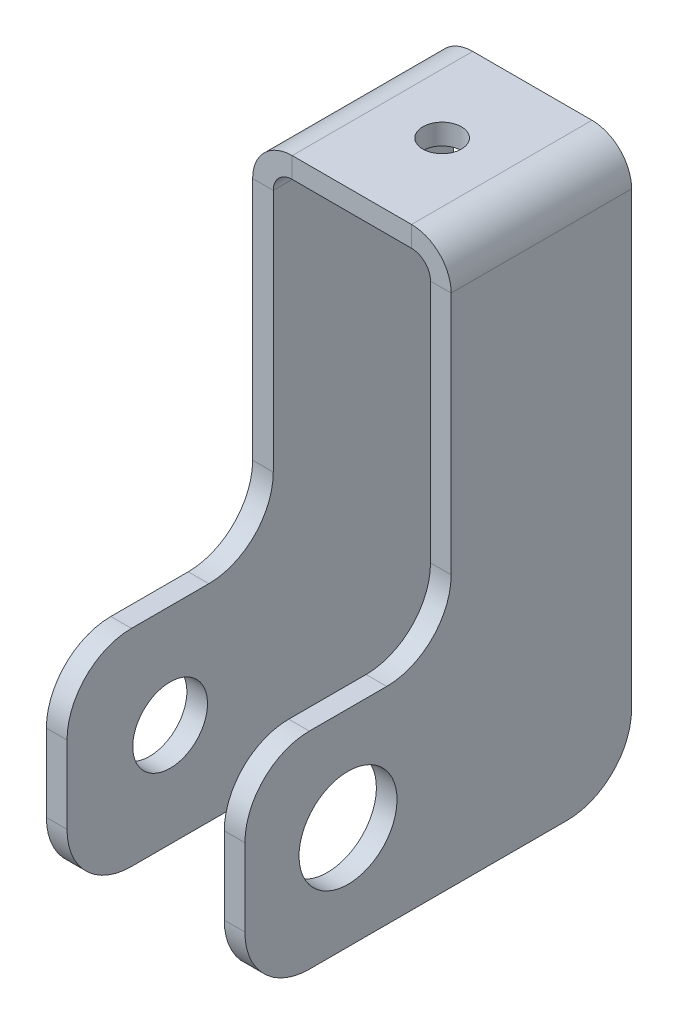
ISO-10303-21;
HEADER;
FILE_DESCRIPTION(('STEP AP214'),'2;1');
FILE_NAME('part.step','',(''),(''),'','','');
FILE_SCHEMA(('AUTOMOTIVE_DESIGN { 1 0 10303 214 1 1 1 1 }'));
ENDSEC;
DATA;
#1=APPLICATION_CONTEXT('core data for automotive mechanical design processes');
#2=APPLICATION_PROTOCOL_DEFINITION('international standard','automotive_design',2000,#1);
#3=PRODUCT_CONTEXT('',#1,'mechanical');
#4=PRODUCT('Part','Part','',(#3));
#5=PRODUCT_RELATED_PRODUCT_CATEGORY('part','',(#4));
#6=PRODUCT_DEFINITION_FORMATION('','',#4);
#7=PRODUCT_DEFINITION_CONTEXT('part definition',#1,'design');
#8=PRODUCT_DEFINITION('design','',#6,#7);
#9=PRODUCT_DEFINITION_SHAPE('','',#8);
#10=(LENGTH_UNIT() NAMED_UNIT(*) SI_UNIT(.MILLI.,.METRE.));
#11=(NAMED_UNIT(*) PLANE_ANGLE_UNIT() SI_UNIT($,.RADIAN.));
#12=(NAMED_UNIT(*) SI_UNIT($,.STERADIAN.) SOLID_ANGLE_UNIT());
#13=UNCERTAINTY_MEASURE_WITH_UNIT(LENGTH_MEASURE(1.E-05),#10,'distance_accuracy_value','');
#14=(GEOMETRIC_REPRESENTATION_CONTEXT(3) GLOBAL_UNCERTAINTY_ASSIGNED_CONTEXT((#13)) GLOBAL_UNIT_ASSIGNED_CONTEXT((#10,
#11,#12)) REPRESENTATION_CONTEXT('',''));
#15=CARTESIAN_POINT('',(0.,0.,0.));
#16=DIRECTION('',(0.,0.,1.));
#17=DIRECTION('',(1.,0.,0.));
#18=AXIS2_PLACEMENT_3D('',#15,#16,#17);
#19=CARTESIAN_POINT('',(0.,-0.8,0.));
#20=DIRECTION('',(0.,1.,0.));
#21=DIRECTION('',(0.,0.,1.));
#22=AXIS2_PLACEMENT_3D('',#19,#20,#21);
#23=PLANE('',#22);
#24=CARTESIAN_POINT('',(2.,-0.8,0.0195312499999961));
#25=DIRECTION('',(0.,1.,0.));
#26=DIRECTION('',(0.,0.,1.));
#27=AXIS2_PLACEMENT_3D('',#24,#25,#26);
#28=CIRCLE('',#27,0.75);
#29=CARTESIAN_POINT('',(2.,-0.8,0.769531249999996));
#30=VERTEX_POINT('',#29);
#31=EDGE_CURVE('E352',#30,#30,#28,.T.);
#32=ORIENTED_EDGE('',*,*,#31,.T.);
#33=EDGE_LOOP('',(#32));
#34=FACE_BOUND('',#33,.T.);
#35=DIRECTION('',(0.,0.,1.));
#36=VECTOR('',#35,1.);
#37=CARTESIAN_POINT('',(4.3134,-0.8,3.51953125));
#38=LINE('',#37,#36);
#39=CARTESIAN_POINT('',(4.3134,-0.8,3.51953125));
#40=VERTEX_POINT('',#39);
#41=CARTESIAN_POINT('',(4.3134,-0.800000000000001,-3.48046875));
#42=VERTEX_POINT('',#41);
#43=EDGE_CURVE('E344',#40,#42,#38,.F.);
#44=ORIENTED_EDGE('',*,*,#43,.F.);
#45=DIRECTION('',(1.,0.,0.));
#46=VECTOR('',#45,1.);
#47=CARTESIAN_POINT('',(-1.85,-0.8,3.51953125));
#48=LINE('',#47,#46);
#49=CARTESIAN_POINT('',(-0.313400000000003,-0.799999999999999,3.51953125));
#50=VERTEX_POINT('',#49);
#51=EDGE_CURVE('E438',#50,#40,#48,.T.);
#52=ORIENTED_EDGE('',*,*,#51,.F.);
#53=DIRECTION('',(0.,0.,-1.));
#54=VECTOR('',#53,1.);
#55=CARTESIAN_POINT('',(-0.313400000000002,-0.8,-3.48046875));
#56=LINE('',#55,#54);
#57=CARTESIAN_POINT('',(-0.313400000000002,-0.8,-3.48046875));
#58=VERTEX_POINT('',#57);
#59=EDGE_CURVE('E428',#58,#50,#56,.F.);
#60=ORIENTED_EDGE('',*,*,#59,.F.);
#61=DIRECTION('',(-1.,0.,0.));
#62=VECTOR('',#61,1.);
#63=CARTESIAN_POINT('',(-1.85,-0.8,-3.48046875));
#64=LINE('',#63,#62);
#65=EDGE_CURVE('E441',#42,#58,#64,.T.);
#66=ORIENTED_EDGE('',*,*,#65,.F.);
#67=EDGE_LOOP('',(#44,#52,#60,#66));
#68=FACE_BOUND('',#67,.T.);
#69=ADVANCED_FACE('F111',(#34,#68),#23,.F.);
#70=CARTESIAN_POINT('',(0.,0.,0.));
#71=DIRECTION('',(0.,1.,0.));
#72=DIRECTION('',(0.,0.,1.));
#73=AXIS2_PLACEMENT_3D('',#70,#71,#72);
#74=PLANE('',#73);
#75=CARTESIAN_POINT('',(2.,0.,0.0195312499999961));
#76=DIRECTION('',(0.,1.,0.));
#77=DIRECTION('',(0.,0.,1.));
#78=AXIS2_PLACEMENT_3D('',#75,#76,#77);
#79=CIRCLE('',#78,0.75);
#80=CARTESIAN_POINT('',(2.,0.,0.769531249999996));
#81=VERTEX_POINT('',#80);
#82=EDGE_CURVE('E350',#81,#81,#79,.T.);
#83=ORIENTED_EDGE('',*,*,#82,.F.);
#84=EDGE_LOOP('',(#83));
#85=FACE_BOUND('',#84,.T.);
#86=DIRECTION('',(1.,0.,0.));
#87=VECTOR('',#86,1.);
#88=CARTESIAN_POINT('',(-1.85,0.,3.51953125));
#89=LINE('',#88,#87);
#90=CARTESIAN_POINT('',(-0.313400000000003,0.,3.51953125));
#91=VERTEX_POINT('',#90);
#92=CARTESIAN_POINT('',(4.3134,0.,3.51953125));
#93=VERTEX_POINT('',#92);
#94=EDGE_CURVE('E435',#91,#93,#89,.T.);
#95=ORIENTED_EDGE('',*,*,#94,.T.);
#96=DIRECTION('',(0.,0.,1.));
#97=VECTOR('',#96,1.);
#98=CARTESIAN_POINT('',(4.3134,0.,3.51953125));
#99=LINE('',#98,#97);
#100=CARTESIAN_POINT('',(4.3134,0.,-3.48046875));
#101=VERTEX_POINT('',#100);
#102=EDGE_CURVE('E283',#93,#101,#99,.F.);
#103=ORIENTED_EDGE('',*,*,#102,.T.);
#104=DIRECTION('',(-1.,0.,0.));
#105=VECTOR('',#104,1.);
#106=CARTESIAN_POINT('',(-1.85,0.,-3.48046875));
#107=LINE('',#106,#105);
#108=CARTESIAN_POINT('',(-0.313400000000002,0.,-3.48046875));
#109=VERTEX_POINT('',#108);
#110=EDGE_CURVE('E442',#101,#109,#107,.T.);
#111=ORIENTED_EDGE('',*,*,#110,.T.);
#112=DIRECTION('',(0.,0.,-1.));
#113=VECTOR('',#112,1.);
#114=CARTESIAN_POINT('',(-0.313400000000002,0.,-3.48046875));
#115=LINE('',#114,#113);
#116=EDGE_CURVE('E415',#109,#91,#115,.F.);
#117=ORIENTED_EDGE('',*,*,#116,.T.);
#118=EDGE_LOOP('',(#95,#103,#111,#117));
#119=FACE_BOUND('',#118,.T.);
#120=ADVANCED_FACE('F534',(#85,#119),#74,.T.);
#121=CARTESIAN_POINT('',(-1.85,-0.8,3.51953125));
#122=DIRECTION('',(0.,0.,1.));
#123=DIRECTION('',(1.,0.,0.));
#124=AXIS2_PLACEMENT_3D('',#121,#122,#123);
#125=PLANE('',#124);
#126=ORIENTED_EDGE('',*,*,#51,.T.);
#127=DIRECTION('',(0.,1.,0.));
#128=VECTOR('',#127,1.);
#129=CARTESIAN_POINT('',(4.3134,-0.8,3.51953125));
#130=LINE('',#129,#128);
#131=EDGE_CURVE('E340',#40,#93,#130,.T.);
#132=ORIENTED_EDGE('',*,*,#131,.T.);
#133=ORIENTED_EDGE('',*,*,#94,.F.);
#134=DIRECTION('',(0.,1.,0.));
#135=VECTOR('',#134,1.);
#136=CARTESIAN_POINT('',(-0.313400000000003,-0.799999999999999,3.51953125));
#137=LINE('',#136,#135);
#138=EDGE_CURVE('E432',#50,#91,#137,.T.);
#139=ORIENTED_EDGE('',*,*,#138,.F.);
#140=EDGE_LOOP('',(#126,#132,#133,#139));
#141=FACE_BOUND('',#140,.T.);
#142=ADVANCED_FACE('F532',(#141),#125,.T.);
#143=CARTESIAN_POINT('',(-1.85,-0.8,-3.48046875));
#144=DIRECTION('',(0.,0.,-1.));
#145=DIRECTION('',(-1.,0.,0.));
#146=AXIS2_PLACEMENT_3D('',#143,#144,#145);
#147=PLANE('',#146);
#148=DIRECTION('',(0.,1.,0.));
#149=VECTOR('',#148,1.);
#150=CARTESIAN_POINT('',(4.3134,-0.800000000000001,-3.48046875));
#151=LINE('',#150,#149);
#152=EDGE_CURVE('E347',#42,#101,#151,.T.);
#153=ORIENTED_EDGE('',*,*,#152,.F.);
#154=ORIENTED_EDGE('',*,*,#65,.T.);
#155=DIRECTION('',(0.,1.,0.));
#156=VECTOR('',#155,1.);
#157=CARTESIAN_POINT('',(-0.313400000000002,-0.8,-3.48046875));
#158=LINE('',#157,#156);
#159=EDGE_CURVE('E422',#58,#109,#158,.T.);
#160=ORIENTED_EDGE('',*,*,#159,.T.);
#161=ORIENTED_EDGE('',*,*,#110,.F.);
#162=EDGE_LOOP('',(#153,#154,#160,#161));
#163=FACE_BOUND('',#162,.T.);
#164=ADVANCED_FACE('F517',(#163),#147,.T.);
#165=CARTESIAN_POINT('',(-0.313400000000003,-1.5366,3.51953125));
#166=DIRECTION('',(0.,0.,1.));
#167=DIRECTION('',(1.,0.,0.));
#168=AXIS2_PLACEMENT_3D('',#165,#166,#167);
#169=PLANE('',#168);
#170=DIRECTION('',(1.,0.,0.));
#171=VECTOR('',#170,1.);
#172=CARTESIAN_POINT('',(-1.85,-1.53659999999999,3.51953125));
#173=LINE('',#172,#171);
#174=CARTESIAN_POINT('',(-1.05,-1.5366,3.51953125));
#175=VERTEX_POINT('',#174);
#176=CARTESIAN_POINT('',(-1.85,-1.53659999999999,3.51953125));
#177=VERTEX_POINT('',#176);
#178=EDGE_CURVE('E361',#175,#177,#173,.F.);
#179=ORIENTED_EDGE('',*,*,#178,.F.);
#180=CARTESIAN_POINT('',(-0.313400000000003,-1.5366,3.51953125));
#181=DIRECTION('',(0.,0.,-1.));
#182=DIRECTION('',(-1.,0.,0.));
#183=AXIS2_PLACEMENT_3D('',#180,#181,#182);
#184=CIRCLE('',#183,0.7366);
#185=EDGE_CURVE('E425',#50,#175,#184,.F.);
#186=ORIENTED_EDGE('',*,*,#185,.F.);
#187=ORIENTED_EDGE('',*,*,#138,.T.);
#188=CARTESIAN_POINT('',(-0.313400000000003,-1.5366,3.51953125));
#189=DIRECTION('',(0.,0.,-1.));
#190=DIRECTION('',(-1.,0.,0.));
#191=AXIS2_PLACEMENT_3D('',#188,#189,#190);
#192=CIRCLE('',#191,1.5366);
#193=EDGE_CURVE('E418',#91,#177,#192,.F.);
#194=ORIENTED_EDGE('',*,*,#193,.T.);
#195=EDGE_LOOP('',(#179,#186,#187,#194));
#196=FACE_BOUND('',#195,.T.);
#197=ADVANCED_FACE('F529',(#196),#169,.T.);
#198=CARTESIAN_POINT('',(-0.313400000000002,-1.5366,-3.48046875));
#199=DIRECTION('',(0.,0.,1.));
#200=DIRECTION('',(1.,0.,0.));
#201=AXIS2_PLACEMENT_3D('',#198,#199,#200);
#202=PLANE('',#201);
#203=CARTESIAN_POINT('',(-0.313400000000002,-1.5366,-3.48046875));
#204=DIRECTION('',(0.,0.,-1.));
#205=DIRECTION('',(-1.,0.,0.));
#206=AXIS2_PLACEMENT_3D('',#203,#204,#205);
#207=CIRCLE('',#206,0.7366);
#208=CARTESIAN_POINT('',(-1.05,-1.5366,-3.48046875));
#209=VERTEX_POINT('',#208);
#210=EDGE_CURVE('E371',#209,#58,#207,.T.);
#211=ORIENTED_EDGE('',*,*,#210,.F.);
#212=DIRECTION('',(1.,0.,0.));
#213=VECTOR('',#212,1.);
#214=CARTESIAN_POINT('',(-1.05,-1.5366,-3.48046875));
#215=LINE('',#214,#213);
#216=CARTESIAN_POINT('',(-1.85,-1.53659999999999,-3.48046875));
#217=VERTEX_POINT('',#216);
#218=EDGE_CURVE('E408',#209,#217,#215,.F.);
#219=ORIENTED_EDGE('',*,*,#218,.T.);
#220=CARTESIAN_POINT('',(-0.313400000000002,-1.5366,-3.48046875));
#221=DIRECTION('',(0.,0.,-1.));
#222=DIRECTION('',(-1.,0.,0.));
#223=AXIS2_PLACEMENT_3D('',#220,#221,#222);
#224=CIRCLE('',#223,1.5366);
#225=EDGE_CURVE('E419',#217,#109,#224,.T.);
#226=ORIENTED_EDGE('',*,*,#225,.T.);
#227=ORIENTED_EDGE('',*,*,#159,.F.);
#228=EDGE_LOOP('',(#211,#219,#226,#227));
#229=FACE_BOUND('',#228,.T.);
#230=ADVANCED_FACE('F539',(#229),#202,.F.);
#231=CARTESIAN_POINT('',(-0.313400000000002,-1.5366,-3.48046875));
#232=DIRECTION('',(0.,0.,-1.));
#233=DIRECTION('',(-1.,0.,0.));
#234=AXIS2_PLACEMENT_3D('',#231,#232,#233);
#235=CYLINDRICAL_SURFACE('',#234,1.5366);
#236=ORIENTED_EDGE('',*,*,#116,.F.);
#237=ORIENTED_EDGE('',*,*,#225,.F.);
#238=DIRECTION('',(0.,0.,-1.));
#239=VECTOR('',#238,1.);
#240=CARTESIAN_POINT('',(-1.85,-1.53659999999999,6.01953125));
#241=LINE('',#240,#239);
#242=EDGE_CURVE('E405',#177,#217,#241,.T.);
#243=ORIENTED_EDGE('',*,*,#242,.F.);
#244=ORIENTED_EDGE('',*,*,#193,.F.);
#245=EDGE_LOOP('',(#236,#237,#243,#244));
#246=FACE_BOUND('',#245,.T.);
#247=ADVANCED_FACE('F537',(#246),#235,.T.);
#248=CARTESIAN_POINT('',(-0.313400000000002,-1.5366,-3.48046875));
#249=DIRECTION('',(0.,0.,-1.));
#250=DIRECTION('',(-1.,0.,0.));
#251=AXIS2_PLACEMENT_3D('',#248,#249,#250);
#252=CYLINDRICAL_SURFACE('',#251,0.7366);
#253=ORIENTED_EDGE('',*,*,#59,.T.);
#254=ORIENTED_EDGE('',*,*,#185,.T.);
#255=DIRECTION('',(0.,0.,1.));
#256=VECTOR('',#255,1.);
#257=CARTESIAN_POINT('',(-1.05,-1.5366,3.51953125));
#258=LINE('',#257,#256);
#259=EDGE_CURVE('E411',#175,#209,#258,.F.);
#260=ORIENTED_EDGE('',*,*,#259,.T.);
#261=ORIENTED_EDGE('',*,*,#210,.T.);
#262=EDGE_LOOP('',(#253,#254,#260,#261));
#263=FACE_BOUND('',#262,.T.);
#264=ADVANCED_FACE('F524',(#263),#252,.F.);
#265=CARTESIAN_POINT('',(-1.85,-0.799999999999997,-3.48046875));
#266=DIRECTION('',(0.,0.,1.));
#267=DIRECTION('',(1.,0.,0.));
#268=AXIS2_PLACEMENT_3D('',#265,#266,#267);
#269=PLANE('',#268);
#270=DIRECTION('',(0.,-1.,0.));
#271=VECTOR('',#270,1.);
#272=CARTESIAN_POINT('',(-1.05,-0.8,-3.48046875));
#273=LINE('',#272,#271);
#274=CARTESIAN_POINT('',(-1.05000000000006,-19.,-3.48046875));
#275=VERTEX_POINT('',#274);
#276=EDGE_CURVE('E402',#209,#275,#273,.T.);
#277=ORIENTED_EDGE('',*,*,#276,.T.);
#278=DIRECTION('',(1.,0.,0.));
#279=VECTOR('',#278,1.);
#280=CARTESIAN_POINT('',(-1.85000000000006,-19.,-3.48046875));
#281=LINE('',#280,#279);
#282=CARTESIAN_POINT('',(-1.85000000000006,-19.,-3.48046875));
#283=VERTEX_POINT('',#282);
#284=EDGE_CURVE('E13',#275,#283,#281,.F.);
#285=ORIENTED_EDGE('',*,*,#284,.T.);
#286=DIRECTION('',(0.,1.,0.));
#287=VECTOR('',#286,1.);
#288=CARTESIAN_POINT('',(-1.85000000000003,-11.,-3.48046875));
#289=LINE('',#288,#287);
#290=EDGE_CURVE('E385',#217,#283,#289,.F.);
#291=ORIENTED_EDGE('',*,*,#290,.F.);
#292=ORIENTED_EDGE('',*,*,#218,.F.);
#293=EDGE_LOOP('',(#277,#285,#291,#292));
#294=FACE_BOUND('',#293,.T.);
#295=ADVANCED_FACE('F548',(#294),#269,.F.);
#296=CARTESIAN_POINT('',(-1.85,-0.799999999999996,3.51953125));
#297=DIRECTION('',(0.,0.,-1.));
#298=DIRECTION('',(-1.,0.,0.));
#299=AXIS2_PLACEMENT_3D('',#296,#297,#298);
#300=PLANE('',#299);
#301=ORIENTED_EDGE('',*,*,#178,.T.);
#302=DIRECTION('',(0.,-1.,0.));
#303=VECTOR('',#302,1.);
#304=CARTESIAN_POINT('',(-1.85000000000004,-11.,3.51953125));
#305=LINE('',#304,#303);
#306=CARTESIAN_POINT('',(-1.85000000000004,-11.,3.51953125));
#307=VERTEX_POINT('',#306);
#308=EDGE_CURVE('E368',#307,#177,#305,.F.);
#309=ORIENTED_EDGE('',*,*,#308,.F.);
#310=DIRECTION('',(1.,0.,0.));
#311=VECTOR('',#310,1.);
#312=CARTESIAN_POINT('',(-1.85000000000004,-11.,3.51953125));
#313=LINE('',#312,#311);
#314=CARTESIAN_POINT('',(-1.05000000000004,-11.,3.51953125));
#315=VERTEX_POINT('',#314);
#316=EDGE_CURVE('E364',#307,#315,#313,.T.);
#317=ORIENTED_EDGE('',*,*,#316,.T.);
#318=DIRECTION('',(0.,1.,0.));
#319=VECTOR('',#318,1.);
#320=CARTESIAN_POINT('',(-1.05,-0.799999999999999,3.51953125));
#321=LINE('',#320,#319);
#322=EDGE_CURVE('E388',#315,#175,#321,.T.);
#323=ORIENTED_EDGE('',*,*,#322,.T.);
#324=EDGE_LOOP('',(#301,#309,#317,#323));
#325=FACE_BOUND('',#324,.T.);
#326=ADVANCED_FACE('F582',(#325),#300,.F.);
#327=CARTESIAN_POINT('',(-1.85000000000004,-11.,6.01953125));
#328=DIRECTION('',(-1.,0.,0.));
#329=DIRECTION('',(0.,-1.,0.));
#330=AXIS2_PLACEMENT_3D('',#327,#328,#329);
#331=PLANE('',#330);
#332=CARTESIAN_POINT('',(-1.85000000000006,-17.5,7.51953125));
#333=DIRECTION('',(-1.,0.,0.));
#334=DIRECTION('',(0.,-1.,0.));
#335=AXIS2_PLACEMENT_3D('',#332,#333,#334);
#336=CIRCLE('',#335,1.45);
#337=CARTESIAN_POINT('',(-1.85000000000006,-18.95,7.51953125));
#338=VERTEX_POINT('',#337);
#339=EDGE_CURVE('E355',#338,#338,#336,.T.);
#340=ORIENTED_EDGE('',*,*,#339,.F.);
#341=EDGE_LOOP('',(#340));
#342=FACE_BOUND('',#341,.T.);
#343=DIRECTION('',(0.,0.,-1.));
#344=VECTOR('',#343,1.);
#345=CARTESIAN_POINT('',(-1.85000000000007,-21.5,6.01953125));
#346=LINE('',#345,#344);
#347=CARTESIAN_POINT('',(-1.85000000000007,-21.5,-0.98046875));
#348=VERTEX_POINT('',#347);
#349=CARTESIAN_POINT('',(-1.85000000000007,-21.5,9.01953125));
#350=VERTEX_POINT('',#349);
#351=EDGE_CURVE('E382',#348,#350,#346,.F.);
#352=ORIENTED_EDGE('',*,*,#351,.T.);
#353=CARTESIAN_POINT('',(-1.85000000000006,-19.,9.01953125));
#354=DIRECTION('',(-1.,0.,0.));
#355=DIRECTION('',(0.,-1.,0.));
#356=AXIS2_PLACEMENT_3D('',#353,#354,#355);
#357=CIRCLE('',#356,2.5);
#358=CARTESIAN_POINT('',(-1.85000000000007,-19.,11.51953125));
#359=VERTEX_POINT('',#358);
#360=EDGE_CURVE('E469',#350,#359,#357,.T.);
#361=ORIENTED_EDGE('',*,*,#360,.T.);
#362=DIRECTION('',(0.,-1.,0.));
#363=VECTOR('',#362,1.);
#364=CARTESIAN_POINT('',(-1.85000000000004,-11.,11.51953125));
#365=LINE('',#364,#363);
#366=CARTESIAN_POINT('',(-1.85000000000005,-16.,11.51953125));
#367=VERTEX_POINT('',#366);
#368=EDGE_CURVE('E379',#359,#367,#365,.F.);
#369=ORIENTED_EDGE('',*,*,#368,.T.);
#370=CARTESIAN_POINT('',(-1.85000000000005,-16.,9.01953125));
#371=DIRECTION('',(-1.,0.,0.));
#372=DIRECTION('',(0.,-1.,0.));
#373=AXIS2_PLACEMENT_3D('',#370,#371,#372);
#374=CIRCLE('',#373,2.5);
#375=CARTESIAN_POINT('',(-1.85000000000005,-13.5,9.01953125));
#376=VERTEX_POINT('',#375);
#377=EDGE_CURVE('E466',#367,#376,#374,.T.);
#378=ORIENTED_EDGE('',*,*,#377,.T.);
#379=DIRECTION('',(0.,0.,1.));
#380=VECTOR('',#379,1.);
#381=CARTESIAN_POINT('',(-1.85000000000005,-13.5,6.01953125));
#382=LINE('',#381,#380);
#383=CARTESIAN_POINT('',(-1.85000000000005,-13.5,6.01953125));
#384=VERTEX_POINT('',#383);
#385=EDGE_CURVE('E376',#376,#384,#382,.F.);
#386=ORIENTED_EDGE('',*,*,#385,.T.);
#387=CARTESIAN_POINT('',(-1.85000000000004,-11.,6.01953125));
#388=DIRECTION('',(-1.,0.,0.));
#389=DIRECTION('',(0.,-1.,0.));
#390=AXIS2_PLACEMENT_3D('',#387,#388,#389);
#391=CIRCLE('',#390,2.5);
#392=EDGE_CURVE('E374',#384,#307,#391,.F.);
#393=ORIENTED_EDGE('',*,*,#392,.T.);
#394=ORIENTED_EDGE('',*,*,#308,.T.);
#395=ORIENTED_EDGE('',*,*,#242,.T.);
#396=ORIENTED_EDGE('',*,*,#290,.T.);
#397=CARTESIAN_POINT('',(-1.85000000000006,-19.,-0.980468750000001));
#398=DIRECTION('',(-1.,0.,0.));
#399=DIRECTION('',(0.,-1.,0.));
#400=AXIS2_PLACEMENT_3D('',#397,#398,#399);
#401=CIRCLE('',#400,2.5);
#402=EDGE_CURVE('E464',#283,#348,#401,.T.);
#403=ORIENTED_EDGE('',*,*,#402,.T.);
#404=EDGE_LOOP('',(#352,#361,#369,#378,#386,#393,#394,#395,#396,#403));
#405=FACE_BOUND('',#404,.T.);
#406=ADVANCED_FACE('F545',(#342,#405),#331,.T.);
#407=CARTESIAN_POINT('',(-1.05000000000004,-11.,6.01953125));
#408=DIRECTION('',(-1.,0.,0.));
#409=DIRECTION('',(0.,-1.,0.));
#410=AXIS2_PLACEMENT_3D('',#407,#408,#409);
#411=PLANE('',#410);
#412=CARTESIAN_POINT('',(-1.05000000000006,-17.5,7.51953125));
#413=DIRECTION('',(-1.,0.,0.));
#414=DIRECTION('',(0.,-1.,0.));
#415=AXIS2_PLACEMENT_3D('',#412,#413,#414);
#416=CIRCLE('',#415,1.45);
#417=CARTESIAN_POINT('',(-1.05000000000006,-18.95,7.51953125));
#418=VERTEX_POINT('',#417);
#419=EDGE_CURVE('E358',#418,#418,#416,.T.);
#420=ORIENTED_EDGE('',*,*,#419,.T.);
#421=EDGE_LOOP('',(#420));
#422=FACE_BOUND('',#421,.T.);
#423=DIRECTION('',(0.,1.,0.));
#424=VECTOR('',#423,1.);
#425=CARTESIAN_POINT('',(-1.05000000000007,-21.5,11.51953125));
#426=LINE('',#425,#424);
#427=CARTESIAN_POINT('',(-1.05000000000006,-19.,11.51953125));
#428=VERTEX_POINT('',#427);
#429=CARTESIAN_POINT('',(-1.05000000000005,-16.,11.51953125));
#430=VERTEX_POINT('',#429);
#431=EDGE_CURVE('E396',#428,#430,#426,.T.);
#432=ORIENTED_EDGE('',*,*,#431,.F.);
#433=CARTESIAN_POINT('',(-1.05000000000006,-19.,9.01953125));
#434=DIRECTION('',(-1.,0.,0.));
#435=DIRECTION('',(0.,-1.,0.));
#436=AXIS2_PLACEMENT_3D('',#433,#434,#435);
#437=CIRCLE('',#436,2.5);
#438=CARTESIAN_POINT('',(-1.05000000000007,-21.5,9.01953125));
#439=VERTEX_POINT('',#438);
#440=EDGE_CURVE('E457',#428,#439,#437,.F.);
#441=ORIENTED_EDGE('',*,*,#440,.T.);
#442=DIRECTION('',(0.,0.,1.));
#443=VECTOR('',#442,1.);
#444=CARTESIAN_POINT('',(-1.05000000000007,-21.5,3.51953125000001));
#445=LINE('',#444,#443);
#446=CARTESIAN_POINT('',(-1.05000000000007,-21.5,-0.98046875));
#447=VERTEX_POINT('',#446);
#448=EDGE_CURVE('E399',#447,#439,#445,.T.);
#449=ORIENTED_EDGE('',*,*,#448,.F.);
#450=CARTESIAN_POINT('',(-1.05000000000006,-19.,-0.980468750000001));
#451=DIRECTION('',(-1.,0.,0.));
#452=DIRECTION('',(0.,-1.,0.));
#453=AXIS2_PLACEMENT_3D('',#450,#451,#452);
#454=CIRCLE('',#453,2.5);
#455=EDGE_CURVE('E452',#447,#275,#454,.F.);
#456=ORIENTED_EDGE('',*,*,#455,.T.);
#457=ORIENTED_EDGE('',*,*,#276,.F.);
#458=ORIENTED_EDGE('',*,*,#259,.F.);
#459=ORIENTED_EDGE('',*,*,#322,.F.);
#460=CARTESIAN_POINT('',(-1.05000000000004,-11.,6.01953125));
#461=DIRECTION('',(-1.,0.,0.));
#462=DIRECTION('',(0.,-1.,0.));
#463=AXIS2_PLACEMENT_3D('',#460,#461,#462);
#464=CIRCLE('',#463,2.5);
#465=CARTESIAN_POINT('',(-1.05000000000004,-13.5,6.01953125));
#466=VERTEX_POINT('',#465);
#467=EDGE_CURVE('E391',#466,#315,#464,.F.);
#468=ORIENTED_EDGE('',*,*,#467,.F.);
#469=DIRECTION('',(0.,0.,-1.));
#470=VECTOR('',#469,1.);
#471=CARTESIAN_POINT('',(-1.05000000000004,-13.5,6.01953125));
#472=LINE('',#471,#470);
#473=CARTESIAN_POINT('',(-1.05000000000005,-13.5,9.01953125));
#474=VERTEX_POINT('',#473);
#475=EDGE_CURVE('E393',#474,#466,#472,.T.);
#476=ORIENTED_EDGE('',*,*,#475,.F.);
#477=CARTESIAN_POINT('',(-1.05000000000005,-16.,9.01953125));
#478=DIRECTION('',(-1.,0.,0.));
#479=DIRECTION('',(0.,-1.,0.));
#480=AXIS2_PLACEMENT_3D('',#477,#478,#479);
#481=CIRCLE('',#480,2.5);
#482=EDGE_CURVE('E454',#474,#430,#481,.F.);
#483=ORIENTED_EDGE('',*,*,#482,.T.);
#484=EDGE_LOOP('',(#432,#441,#449,#456,#457,#458,#459,#468,#476,#483));
#485=FACE_BOUND('',#484,.T.);
#486=ADVANCED_FACE('F584',(#422,#485),#411,.F.);
#487=CARTESIAN_POINT('',(-1.85000000000007,-21.5,3.51953125000001));
#488=DIRECTION('',(0.,1.,0.));
#489=DIRECTION('',(-1.,0.,0.));
#490=AXIS2_PLACEMENT_3D('',#487,#488,#489);
#491=PLANE('',#490);
#492=ORIENTED_EDGE('',*,*,#448,.T.);
#493=DIRECTION('',(1.,0.,0.));
#494=VECTOR('',#493,1.);
#495=CARTESIAN_POINT('',(-1.85000000000007,-21.5,9.01953125));
#496=LINE('',#495,#494);
#497=EDGE_CURVE('E462',#439,#350,#496,.F.);
#498=ORIENTED_EDGE('',*,*,#497,.T.);
#499=ORIENTED_EDGE('',*,*,#351,.F.);
#500=DIRECTION('',(1.,0.,0.));
#501=VECTOR('',#500,1.);
#502=CARTESIAN_POINT('',(-1.85000000000007,-21.5,-0.98046875));
#503=LINE('',#502,#501);
#504=EDGE_CURVE('E459',#348,#447,#503,.T.);
#505=ORIENTED_EDGE('',*,*,#504,.T.);
#506=EDGE_LOOP('',(#492,#498,#499,#505));
#507=FACE_BOUND('',#506,.T.);
#508=ADVANCED_FACE('F555',(#507),#491,.F.);
#509=CARTESIAN_POINT('',(-1.85000000000007,-21.5,11.51953125));
#510=DIRECTION('',(0.,0.,-1.));
#511=DIRECTION('',(0.,1.,0.));
#512=AXIS2_PLACEMENT_3D('',#509,#510,#511);
#513=PLANE('',#512);
#514=ORIENTED_EDGE('',*,*,#368,.F.);
#515=DIRECTION('',(1.,0.,0.));
#516=VECTOR('',#515,1.);
#517=CARTESIAN_POINT('',(-1.85000000000007,-19.,11.51953125));
#518=LINE('',#517,#516);
#519=EDGE_CURVE('E449',#359,#428,#518,.T.);
#520=ORIENTED_EDGE('',*,*,#519,.T.);
#521=ORIENTED_EDGE('',*,*,#431,.T.);
#522=DIRECTION('',(1.,0.,0.));
#523=VECTOR('',#522,1.);
#524=CARTESIAN_POINT('',(-1.85000000000005,-16.,11.51953125));
#525=LINE('',#524,#523);
#526=EDGE_CURVE('E444',#430,#367,#525,.F.);
#527=ORIENTED_EDGE('',*,*,#526,.T.);
#528=EDGE_LOOP('',(#514,#520,#521,#527));
#529=FACE_BOUND('',#528,.T.);
#530=ADVANCED_FACE('F564',(#529),#513,.F.);
#531=CARTESIAN_POINT('',(-1.85000000000005,-13.5,6.01953125));
#532=DIRECTION('',(0.,-1.,0.));
#533=DIRECTION('',(1.,0.,0.));
#534=AXIS2_PLACEMENT_3D('',#531,#532,#533);
#535=PLANE('',#534);
#536=ORIENTED_EDGE('',*,*,#385,.F.);
#537=DIRECTION('',(1.,0.,0.));
#538=VECTOR('',#537,1.);
#539=CARTESIAN_POINT('',(-1.85000000000005,-13.5,9.01953125));
#540=LINE('',#539,#538);
#541=EDGE_CURVE('E493',#376,#474,#540,.T.);
#542=ORIENTED_EDGE('',*,*,#541,.T.);
#543=ORIENTED_EDGE('',*,*,#475,.T.);
#544=DIRECTION('',(1.,0.,0.));
#545=VECTOR('',#544,1.);
#546=CARTESIAN_POINT('',(-1.85000000000005,-13.5,6.01953125));
#547=LINE('',#546,#545);
#548=EDGE_CURVE('E367',#384,#466,#547,.T.);
#549=ORIENTED_EDGE('',*,*,#548,.F.);
#550=EDGE_LOOP('',(#536,#542,#543,#549));
#551=FACE_BOUND('',#550,.T.);
#552=ADVANCED_FACE('F573',(#551),#535,.F.);
#553=CARTESIAN_POINT('',(-1.85000000000004,-11.,6.01953125));
#554=DIRECTION('',(1.,0.,0.));
#555=DIRECTION('',(0.,1.,0.));
#556=AXIS2_PLACEMENT_3D('',#553,#554,#555);
#557=CYLINDRICAL_SURFACE('',#556,2.5);
#558=ORIENTED_EDGE('',*,*,#467,.T.);
#559=ORIENTED_EDGE('',*,*,#316,.F.);
#560=ORIENTED_EDGE('',*,*,#392,.F.);
#561=ORIENTED_EDGE('',*,*,#548,.T.);
#562=EDGE_LOOP('',(#558,#559,#560,#561));
#563=FACE_BOUND('',#562,.T.);
#564=ADVANCED_FACE('F579',(#563),#557,.F.);
#565=CARTESIAN_POINT('',(-1.05000000000006,-17.5,7.51953125));
#566=DIRECTION('',(-1.,0.,0.));
#567=DIRECTION('',(0.,-1.,0.));
#568=AXIS2_PLACEMENT_3D('',#565,#566,#567);
#569=CYLINDRICAL_SURFACE('',#568,1.45);
#570=ORIENTED_EDGE('',*,*,#419,.F.);
#571=EDGE_LOOP('',(#570));
#572=FACE_BOUND('',#571,.T.);
#573=ORIENTED_EDGE('',*,*,#339,.T.);
#574=EDGE_LOOP('',(#573));
#575=FACE_BOUND('',#574,.T.);
#576=ADVANCED_FACE('F682',(#572,#575),#569,.F.);
#577=CARTESIAN_POINT('',(2.,-0.8,0.0195312499999961));
#578=DIRECTION('',(0.,1.,0.));
#579=DIRECTION('',(0.,0.,1.));
#580=AXIS2_PLACEMENT_3D('',#577,#578,#579);
#581=CYLINDRICAL_SURFACE('',#580,0.75);
#582=ORIENTED_EDGE('',*,*,#31,.F.);
#583=EDGE_LOOP('',(#582));
#584=FACE_BOUND('',#583,.T.);
#585=ORIENTED_EDGE('',*,*,#82,.T.);
#586=EDGE_LOOP('',(#585));
#587=FACE_BOUND('',#586,.T.);
#588=ADVANCED_FACE('F677',(#584,#587),#581,.F.);
#589=CARTESIAN_POINT('',(4.3134,-1.5366,-3.48046875));
#590=DIRECTION('',(0.,0.,-1.));
#591=DIRECTION('',(0.,1.,0.));
#592=AXIS2_PLACEMENT_3D('',#589,#590,#591);
#593=PLANE('',#592);
#594=DIRECTION('',(1.,0.,0.));
#595=VECTOR('',#594,1.);
#596=CARTESIAN_POINT('',(5.85,-1.5366,-3.48046875));
#597=LINE('',#596,#595);
#598=CARTESIAN_POINT('',(5.05,-1.5366,-3.48046875));
#599=VERTEX_POINT('',#598);
#600=CARTESIAN_POINT('',(5.85,-1.5366,-3.48046875));
#601=VERTEX_POINT('',#600);
#602=EDGE_CURVE('E335',#599,#601,#597,.T.);
#603=ORIENTED_EDGE('',*,*,#602,.F.);
#604=CARTESIAN_POINT('',(4.3134,-1.5366,-3.48046875));
#605=DIRECTION('',(0.,0.,1.));
#606=DIRECTION('',(0.,-1.,0.));
#607=AXIS2_PLACEMENT_3D('',#604,#605,#606);
#608=CIRCLE('',#607,0.7366);
#609=EDGE_CURVE('E286',#42,#599,#608,.F.);
#610=ORIENTED_EDGE('',*,*,#609,.F.);
#611=ORIENTED_EDGE('',*,*,#152,.T.);
#612=CARTESIAN_POINT('',(4.3134,-1.5366,-3.48046875));
#613=DIRECTION('',(0.,0.,1.));
#614=DIRECTION('',(0.,-1.,0.));
#615=AXIS2_PLACEMENT_3D('',#612,#613,#614);
#616=CIRCLE('',#615,1.5366);
#617=EDGE_CURVE('E339',#101,#601,#616,.F.);
#618=ORIENTED_EDGE('',*,*,#617,.T.);
#619=EDGE_LOOP('',(#603,#610,#611,#618));
#620=FACE_BOUND('',#619,.T.);
#621=ADVANCED_FACE('F513',(#620),#593,.T.);
#622=CARTESIAN_POINT('',(4.3134,-1.5366,3.51953125));
#623=DIRECTION('',(0.,0.,-1.));
#624=DIRECTION('',(0.,1.,0.));
#625=AXIS2_PLACEMENT_3D('',#622,#623,#624);
#626=PLANE('',#625);
#627=CARTESIAN_POINT('',(4.3134,-1.5366,3.51953125));
#628=DIRECTION('',(0.,0.,1.));
#629=DIRECTION('',(0.,-1.,0.));
#630=AXIS2_PLACEMENT_3D('',#627,#628,#629);
#631=CIRCLE('',#630,0.7366);
#632=CARTESIAN_POINT('',(5.05,-1.5366,3.51953125));
#633=VERTEX_POINT('',#632);
#634=EDGE_CURVE('E293',#633,#40,#631,.T.);
#635=ORIENTED_EDGE('',*,*,#634,.F.);
#636=DIRECTION('',(1.,0.,0.));
#637=VECTOR('',#636,1.);
#638=CARTESIAN_POINT('',(5.05,-1.5366,3.51953125));
#639=LINE('',#638,#637);
#640=CARTESIAN_POINT('',(5.85,-1.53659999999999,3.51953125));
#641=VERTEX_POINT('',#640);
#642=EDGE_CURVE('E290',#633,#641,#639,.T.);
#643=ORIENTED_EDGE('',*,*,#642,.T.);
#644=CARTESIAN_POINT('',(4.3134,-1.5366,3.51953125));
#645=DIRECTION('',(0.,0.,1.));
#646=DIRECTION('',(0.,-1.,0.));
#647=AXIS2_PLACEMENT_3D('',#644,#645,#646);
#648=CIRCLE('',#647,1.5366);
#649=EDGE_CURVE('E276',#641,#93,#648,.T.);
#650=ORIENTED_EDGE('',*,*,#649,.T.);
#651=ORIENTED_EDGE('',*,*,#131,.F.);
#652=EDGE_LOOP('',(#635,#643,#650,#651));
#653=FACE_BOUND('',#652,.T.);
#654=ADVANCED_FACE('F291',(#653),#626,.F.);
#655=CARTESIAN_POINT('',(4.3134,-1.5366,3.51953125));
#656=DIRECTION('',(0.,0.,1.));
#657=DIRECTION('',(1.,0.,0.));
#658=AXIS2_PLACEMENT_3D('',#655,#656,#657);
#659=CYLINDRICAL_SURFACE('',#658,1.5366);
#660=ORIENTED_EDGE('',*,*,#102,.F.);
#661=ORIENTED_EDGE('',*,*,#649,.F.);
#662=DIRECTION('',(0.,0.,1.));
#663=VECTOR('',#662,1.);
#664=CARTESIAN_POINT('',(5.85,-1.53659999999999,6.01953125));
#665=LINE('',#664,#663);
#666=EDGE_CURVE('E280',#601,#641,#665,.T.);
#667=ORIENTED_EDGE('',*,*,#666,.F.);
#668=ORIENTED_EDGE('',*,*,#617,.F.);
#669=EDGE_LOOP('',(#660,#661,#667,#668));
#670=FACE_BOUND('',#669,.T.);
#671=ADVANCED_FACE('F278',(#670),#659,.T.);
#672=CARTESIAN_POINT('',(4.3134,-1.5366,3.51953125));
#673=DIRECTION('',(0.,0.,1.));
#674=DIRECTION('',(1.,0.,0.));
#675=AXIS2_PLACEMENT_3D('',#672,#673,#674);
#676=CYLINDRICAL_SURFACE('',#675,0.7366);
#677=ORIENTED_EDGE('',*,*,#43,.T.);
#678=ORIENTED_EDGE('',*,*,#609,.T.);
#679=DIRECTION('',(0.,0.,-1.));
#680=VECTOR('',#679,1.);
#681=CARTESIAN_POINT('',(5.05,-1.5366,-3.48046875));
#682=LINE('',#681,#680);
#683=EDGE_CURVE('E298',#599,#633,#682,.F.);
#684=ORIENTED_EDGE('',*,*,#683,.T.);
#685=ORIENTED_EDGE('',*,*,#634,.T.);
#686=EDGE_LOOP('',(#677,#678,#684,#685));
#687=FACE_BOUND('',#686,.T.);
#688=ADVANCED_FACE('F508',(#687),#676,.F.);
#689=CARTESIAN_POINT('',(5.85,-0.799999999999997,-3.48046875));
#690=DIRECTION('',(0.,0.,-1.));
#691=DIRECTION('',(-1.,0.,0.));
#692=AXIS2_PLACEMENT_3D('',#689,#690,#691);
#693=PLANE('',#692);
#694=DIRECTION('',(0.,-1.,0.));
#695=VECTOR('',#694,1.);
#696=CARTESIAN_POINT('',(5.85,-0.799999999999997,-3.48046875));
#697=LINE('',#696,#695);
#698=CARTESIAN_POINT('',(5.85000000000006,-19.,-3.48046875));
#699=VERTEX_POINT('',#698);
#700=EDGE_CURVE('E306',#601,#699,#697,.T.);
#701=ORIENTED_EDGE('',*,*,#700,.T.);
#702=DIRECTION('',(-1.,0.,0.));
#703=VECTOR('',#702,1.);
#704=CARTESIAN_POINT('',(5.85000000000006,-19.,-3.48046875));
#705=LINE('',#704,#703);
#706=CARTESIAN_POINT('',(5.05000000000006,-19.,-3.48046875));
#707=VERTEX_POINT('',#706);
#708=EDGE_CURVE('E120',#699,#707,#705,.T.);
#709=ORIENTED_EDGE('',*,*,#708,.T.);
#710=DIRECTION('',(0.,1.,0.));
#711=VECTOR('',#710,1.);
#712=CARTESIAN_POINT('',(5.05000000000003,-11.,-3.48046875));
#713=LINE('',#712,#711);
#714=EDGE_CURVE('E307',#599,#707,#713,.F.);
#715=ORIENTED_EDGE('',*,*,#714,.F.);
#716=ORIENTED_EDGE('',*,*,#602,.T.);
#717=EDGE_LOOP('',(#701,#709,#715,#716));
#718=FACE_BOUND('',#717,.T.);
#719=ADVANCED_FACE('F501',(#718),#693,.T.);
#720=CARTESIAN_POINT('',(5.85,-0.799999999999996,3.51953125));
#721=DIRECTION('',(0.,0.,1.));
#722=DIRECTION('',(1.,0.,0.));
#723=AXIS2_PLACEMENT_3D('',#720,#721,#722);
#724=PLANE('',#723);
#725=DIRECTION('',(0.,1.,0.));
#726=VECTOR('',#725,1.);
#727=CARTESIAN_POINT('',(5.85,-0.799999999999996,3.51953125));
#728=LINE('',#727,#726);
#729=CARTESIAN_POINT('',(5.85000000000004,-11.,3.51953125));
#730=VERTEX_POINT('',#729);
#731=EDGE_CURVE('E304',#730,#641,#728,.T.);
#732=ORIENTED_EDGE('',*,*,#731,.T.);
#733=ORIENTED_EDGE('',*,*,#642,.F.);
#734=DIRECTION('',(0.,-1.,0.));
#735=VECTOR('',#734,1.);
#736=CARTESIAN_POINT('',(5.05000000000004,-11.,3.51953125));
#737=LINE('',#736,#735);
#738=CARTESIAN_POINT('',(5.05000000000004,-11.,3.51953125));
#739=VERTEX_POINT('',#738);
#740=EDGE_CURVE('E330',#739,#633,#737,.F.);
#741=ORIENTED_EDGE('',*,*,#740,.F.);
#742=DIRECTION('',(-1.,0.,0.));
#743=VECTOR('',#742,1.);
#744=CARTESIAN_POINT('',(5.85000000000004,-11.,3.51953125));
#745=LINE('',#744,#743);
#746=EDGE_CURVE('E310',#730,#739,#745,.T.);
#747=ORIENTED_EDGE('',*,*,#746,.F.);
#748=EDGE_LOOP('',(#732,#733,#741,#747));
#749=FACE_BOUND('',#748,.T.);
#750=ADVANCED_FACE('F309',(#749),#724,.T.);
#751=CARTESIAN_POINT('',(5.85000000000004,-11.,6.01953125));
#752=DIRECTION('',(1.,0.,0.));
#753=DIRECTION('',(0.,-1.,0.));
#754=AXIS2_PLACEMENT_3D('',#751,#752,#753);
#755=PLANE('',#754);
#756=CARTESIAN_POINT('',(5.85000000000006,-17.5,7.51953125));
#757=DIRECTION('',(1.,0.,0.));
#758=DIRECTION('',(0.,1.,0.));
#759=AXIS2_PLACEMENT_3D('',#756,#757,#758);
#760=CIRCLE('',#759,1.9);
#761=CARTESIAN_POINT('',(5.85000000000005,-15.6,7.51953125));
#762=VERTEX_POINT('',#761);
#763=EDGE_CURVE('E996',#762,#762,#760,.T.);
#764=ORIENTED_EDGE('',*,*,#763,.F.);
#765=EDGE_LOOP('',(#764));
#766=FACE_BOUND('',#765,.T.);
#767=DIRECTION('',(0.,1.,0.));
#768=VECTOR('',#767,1.);
#769=CARTESIAN_POINT('',(5.85000000000007,-21.5,11.51953125));
#770=LINE('',#769,#768);
#771=CARTESIAN_POINT('',(5.85000000000007,-19.,11.51953125));
#772=VERTEX_POINT('',#771);
#773=CARTESIAN_POINT('',(5.85000000000005,-16.,11.51953125));
#774=VERTEX_POINT('',#773);
#775=EDGE_CURVE('E637',#772,#774,#770,.T.);
#776=ORIENTED_EDGE('',*,*,#775,.F.);
#777=CARTESIAN_POINT('',(5.85000000000006,-19.,9.01953125));
#778=DIRECTION('',(1.,0.,0.));
#779=DIRECTION('',(0.,1.,0.));
#780=AXIS2_PLACEMENT_3D('',#777,#778,#779);
#781=CIRCLE('',#780,2.5);
#782=CARTESIAN_POINT('',(5.85000000000007,-21.5,9.01953125));
#783=VERTEX_POINT('',#782);
#784=EDGE_CURVE('E490',#772,#783,#781,.T.);
#785=ORIENTED_EDGE('',*,*,#784,.T.);
#786=DIRECTION('',(0.,0.,1.));
#787=VECTOR('',#786,1.);
#788=CARTESIAN_POINT('',(5.85000000000007,-21.5,-3.48046875));
#789=LINE('',#788,#787);
#790=CARTESIAN_POINT('',(5.85000000000007,-21.5,-0.980468750000002));
#791=VERTEX_POINT('',#790);
#792=EDGE_CURVE('E632',#791,#783,#789,.T.);
#793=ORIENTED_EDGE('',*,*,#792,.F.);
#794=CARTESIAN_POINT('',(5.85000000000006,-19.,-0.980468750000001));
#795=DIRECTION('',(1.,0.,0.));
#796=DIRECTION('',(0.,1.,0.));
#797=AXIS2_PLACEMENT_3D('',#794,#795,#796);
#798=CIRCLE('',#797,2.5);
#799=EDGE_CURVE('E135',#791,#699,#798,.T.);
#800=ORIENTED_EDGE('',*,*,#799,.T.);
#801=ORIENTED_EDGE('',*,*,#700,.F.);
#802=ORIENTED_EDGE('',*,*,#666,.T.);
#803=ORIENTED_EDGE('',*,*,#731,.F.);
#804=CARTESIAN_POINT('',(5.85000000000004,-11.,6.01953125));
#805=DIRECTION('',(1.,0.,0.));
#806=DIRECTION('',(0.,1.,0.));
#807=AXIS2_PLACEMENT_3D('',#804,#805,#806);
#808=CIRCLE('',#807,2.5);
#809=CARTESIAN_POINT('',(5.85000000000004,-13.5,6.01953125));
#810=VERTEX_POINT('',#809);
#811=EDGE_CURVE('E311',#810,#730,#808,.T.);
#812=ORIENTED_EDGE('',*,*,#811,.F.);
#813=DIRECTION('',(0.,0.,-1.));
#814=VECTOR('',#813,1.);
#815=CARTESIAN_POINT('',(5.85000000000004,-13.5,6.01953125));
#816=LINE('',#815,#814);
#817=CARTESIAN_POINT('',(5.85000000000004,-13.5,9.01953125));
#818=VERTEX_POINT('',#817);
#819=EDGE_CURVE('E313',#818,#810,#816,.T.);
#820=ORIENTED_EDGE('',*,*,#819,.F.);
#821=CARTESIAN_POINT('',(5.85000000000005,-16.,9.01953125));
#822=DIRECTION('',(1.,0.,0.));
#823=DIRECTION('',(0.,1.,0.));
#824=AXIS2_PLACEMENT_3D('',#821,#822,#823);
#825=CIRCLE('',#824,2.5);
#826=EDGE_CURVE('E488',#818,#774,#825,.T.);
#827=ORIENTED_EDGE('',*,*,#826,.T.);
#828=EDGE_LOOP('',(#776,#785,#793,#800,#801,#802,#803,#812,#820,#827));
#829=FACE_BOUND('',#828,.T.);
#830=ADVANCED_FACE('F302',(#766,#829),#755,.T.);
#831=CARTESIAN_POINT('',(5.05000000000004,-11.,6.01953125));
#832=DIRECTION('',(1.,0.,0.));
#833=DIRECTION('',(0.,-1.,0.));
#834=AXIS2_PLACEMENT_3D('',#831,#832,#833);
#835=PLANE('',#834);
#836=CARTESIAN_POINT('',(5.05000000000006,-17.5,7.51953125));
#837=DIRECTION('',(1.,0.,0.));
#838=DIRECTION('',(0.,1.,0.));
#839=AXIS2_PLACEMENT_3D('',#836,#837,#838);
#840=CIRCLE('',#839,1.9);
#841=CARTESIAN_POINT('',(5.05000000000005,-15.6,7.51953125));
#842=VERTEX_POINT('',#841);
#843=EDGE_CURVE('E115',#842,#842,#840,.T.);
#844=ORIENTED_EDGE('',*,*,#843,.T.);
#845=EDGE_LOOP('',(#844));
#846=FACE_BOUND('',#845,.T.);
#847=DIRECTION('',(0.,0.,-1.));
#848=VECTOR('',#847,1.);
#849=CARTESIAN_POINT('',(5.05000000000007,-21.5,6.01953124999999));
#850=LINE('',#849,#848);
#851=CARTESIAN_POINT('',(5.05000000000007,-21.5,-0.980468750000002));
#852=VERTEX_POINT('',#851);
#853=CARTESIAN_POINT('',(5.05000000000007,-21.5,9.01953125));
#854=VERTEX_POINT('',#853);
#855=EDGE_CURVE('E315',#852,#854,#850,.F.);
#856=ORIENTED_EDGE('',*,*,#855,.T.);
#857=CARTESIAN_POINT('',(5.05000000000006,-19.,9.01953125));
#858=DIRECTION('',(1.,0.,0.));
#859=DIRECTION('',(0.,1.,0.));
#860=AXIS2_PLACEMENT_3D('',#857,#858,#859);
#861=CIRCLE('',#860,2.5);
#862=CARTESIAN_POINT('',(5.05000000000006,-19.,11.51953125));
#863=VERTEX_POINT('',#862);
#864=EDGE_CURVE('E480',#854,#863,#861,.F.);
#865=ORIENTED_EDGE('',*,*,#864,.T.);
#866=DIRECTION('',(0.,-1.,0.));
#867=VECTOR('',#866,1.);
#868=CARTESIAN_POINT('',(5.05000000000004,-11.,11.51953125));
#869=LINE('',#868,#867);
#870=CARTESIAN_POINT('',(5.05000000000005,-16.,11.51953125));
#871=VERTEX_POINT('',#870);
#872=EDGE_CURVE('E322',#863,#871,#869,.F.);
#873=ORIENTED_EDGE('',*,*,#872,.T.);
#874=CARTESIAN_POINT('',(5.05000000000005,-16.,9.01953125));
#875=DIRECTION('',(1.,0.,0.));
#876=DIRECTION('',(0.,1.,0.));
#877=AXIS2_PLACEMENT_3D('',#874,#875,#876);
#878=CIRCLE('',#877,2.5);
#879=CARTESIAN_POINT('',(5.05000000000005,-13.5,9.01953125));
#880=VERTEX_POINT('',#879);
#881=EDGE_CURVE('E478',#871,#880,#878,.F.);
#882=ORIENTED_EDGE('',*,*,#881,.T.);
#883=DIRECTION('',(0.,0.,1.));
#884=VECTOR('',#883,1.);
#885=CARTESIAN_POINT('',(5.05000000000004,-13.5,6.01953125));
#886=LINE('',#885,#884);
#887=CARTESIAN_POINT('',(5.05000000000004,-13.5,6.01953125));
#888=VERTEX_POINT('',#887);
#889=EDGE_CURVE('E325',#880,#888,#886,.F.);
#890=ORIENTED_EDGE('',*,*,#889,.T.);
#891=CARTESIAN_POINT('',(5.05000000000004,-11.,6.01953125));
#892=DIRECTION('',(1.,0.,0.));
#893=DIRECTION('',(0.,1.,0.));
#894=AXIS2_PLACEMENT_3D('',#891,#892,#893);
#895=CIRCLE('',#894,2.5);
#896=EDGE_CURVE('E327',#888,#739,#895,.T.);
#897=ORIENTED_EDGE('',*,*,#896,.T.);
#898=ORIENTED_EDGE('',*,*,#740,.T.);
#899=ORIENTED_EDGE('',*,*,#683,.F.);
#900=ORIENTED_EDGE('',*,*,#714,.T.);
#901=CARTESIAN_POINT('',(5.05000000000006,-19.,-0.980468750000001));
#902=DIRECTION('',(1.,0.,0.));
#903=DIRECTION('',(0.,1.,0.));
#904=AXIS2_PLACEMENT_3D('',#901,#902,#903);
#905=CIRCLE('',#904,2.5);
#906=EDGE_CURVE('E476',#707,#852,#905,.F.);
#907=ORIENTED_EDGE('',*,*,#906,.T.);
#908=EDGE_LOOP('',(#856,#865,#873,#882,#890,#897,#898,#899,#900,#907));
#909=FACE_BOUND('',#908,.T.);
#910=ADVANCED_FACE('F505',(#846,#909),#835,.F.);
#911=CARTESIAN_POINT('',(5.85000000000004,-11.,6.01953125));
#912=DIRECTION('',(-1.,0.,0.));
#913=DIRECTION('',(0.,-1.,0.));
#914=AXIS2_PLACEMENT_3D('',#911,#912,#913);
#915=CYLINDRICAL_SURFACE('',#914,2.5);
#916=ORIENTED_EDGE('',*,*,#896,.F.);
#917=DIRECTION('',(-1.,0.,0.));
#918=VECTOR('',#917,1.);
#919=CARTESIAN_POINT('',(5.85000000000004,-13.5,6.01953125));
#920=LINE('',#919,#918);
#921=EDGE_CURVE('E636',#810,#888,#920,.T.);
#922=ORIENTED_EDGE('',*,*,#921,.F.);
#923=ORIENTED_EDGE('',*,*,#811,.T.);
#924=ORIENTED_EDGE('',*,*,#746,.T.);
#925=EDGE_LOOP('',(#916,#922,#923,#924));
#926=FACE_BOUND('',#925,.T.);
#927=ADVANCED_FACE('F649',(#926),#915,.F.);
#928=CARTESIAN_POINT('',(5.85000000000004,-13.5,6.01953125));
#929=DIRECTION('',(0.,1.,0.));
#930=DIRECTION('',(-1.,0.,0.));
#931=AXIS2_PLACEMENT_3D('',#928,#929,#930);
#932=PLANE('',#931);
#933=ORIENTED_EDGE('',*,*,#889,.F.);
#934=DIRECTION('',(-1.,0.,0.));
#935=VECTOR('',#934,1.);
#936=CARTESIAN_POINT('',(5.85000000000004,-13.5,9.01953125));
#937=LINE('',#936,#935);
#938=EDGE_CURVE('E127',#880,#818,#937,.F.);
#939=ORIENTED_EDGE('',*,*,#938,.T.);
#940=ORIENTED_EDGE('',*,*,#819,.T.);
#941=ORIENTED_EDGE('',*,*,#921,.T.);
#942=EDGE_LOOP('',(#933,#939,#940,#941));
#943=FACE_BOUND('',#942,.T.);
#944=ADVANCED_FACE('F645',(#943),#932,.T.);
#945=CARTESIAN_POINT('',(5.85000000000007,-21.5,11.51953125));
#946=DIRECTION('',(0.,0.,1.));
#947=DIRECTION('',(0.,-1.,0.));
#948=AXIS2_PLACEMENT_3D('',#945,#946,#947);
#949=PLANE('',#948);
#950=ORIENTED_EDGE('',*,*,#872,.F.);
#951=DIRECTION('',(-1.,0.,0.));
#952=VECTOR('',#951,1.);
#953=CARTESIAN_POINT('',(5.85000000000007,-19.,11.51953125));
#954=LINE('',#953,#952);
#955=EDGE_CURVE('E485',#863,#772,#954,.F.);
#956=ORIENTED_EDGE('',*,*,#955,.T.);
#957=ORIENTED_EDGE('',*,*,#775,.T.);
#958=DIRECTION('',(-1.,0.,0.));
#959=VECTOR('',#958,1.);
#960=CARTESIAN_POINT('',(5.85000000000005,-16.,11.51953125));
#961=LINE('',#960,#959);
#962=EDGE_CURVE('E482',#774,#871,#961,.T.);
#963=ORIENTED_EDGE('',*,*,#962,.T.);
#964=EDGE_LOOP('',(#950,#956,#957,#963));
#965=FACE_BOUND('',#964,.T.);
#966=ADVANCED_FACE('F653',(#965),#949,.T.);
#967=CARTESIAN_POINT('',(5.85000000000007,-21.5,-3.48046875));
#968=DIRECTION('',(0.,-1.,0.));
#969=DIRECTION('',(1.,0.,0.));
#970=AXIS2_PLACEMENT_3D('',#967,#968,#969);
#971=PLANE('',#970);
#972=ORIENTED_EDGE('',*,*,#792,.T.);
#973=DIRECTION('',(-1.,0.,0.));
#974=VECTOR('',#973,1.);
#975=CARTESIAN_POINT('',(5.85000000000007,-21.5,9.01953125));
#976=LINE('',#975,#974);
#977=EDGE_CURVE('E473',#783,#854,#976,.T.);
#978=ORIENTED_EDGE('',*,*,#977,.T.);
#979=ORIENTED_EDGE('',*,*,#855,.F.);
#980=DIRECTION('',(-1.,0.,0.));
#981=VECTOR('',#980,1.);
#982=CARTESIAN_POINT('',(5.85000000000007,-21.5,-0.980468750000002));
#983=LINE('',#982,#981);
#984=EDGE_CURVE('E471',#852,#791,#983,.F.);
#985=ORIENTED_EDGE('',*,*,#984,.T.);
#986=EDGE_LOOP('',(#972,#978,#979,#985));
#987=FACE_BOUND('',#986,.T.);
#988=ADVANCED_FACE('F614',(#987),#971,.T.);
#989=CARTESIAN_POINT('',(-1.85000000000006,-19.,9.01953125));
#990=DIRECTION('',(1.,0.,0.));
#991=DIRECTION('',(0.,1.,0.));
#992=AXIS2_PLACEMENT_3D('',#989,#990,#991);
#993=CYLINDRICAL_SURFACE('',#992,2.5);
#994=ORIENTED_EDGE('',*,*,#360,.F.);
#995=ORIENTED_EDGE('',*,*,#497,.F.);
#996=ORIENTED_EDGE('',*,*,#440,.F.);
#997=ORIENTED_EDGE('',*,*,#519,.F.);
#998=EDGE_LOOP('',(#994,#995,#996,#997));
#999=FACE_BOUND('',#998,.T.);
#1000=ADVANCED_FACE('F559',(#999),#993,.T.);
#1001=CARTESIAN_POINT('',(5.85000000000006,-19.,9.01953125));
#1002=DIRECTION('',(-1.,0.,0.));
#1003=DIRECTION('',(0.,-1.,0.));
#1004=AXIS2_PLACEMENT_3D('',#1001,#1002,#1003);
#1005=CYLINDRICAL_SURFACE('',#1004,2.5);
#1006=ORIENTED_EDGE('',*,*,#784,.F.);
#1007=ORIENTED_EDGE('',*,*,#955,.F.);
#1008=ORIENTED_EDGE('',*,*,#864,.F.);
#1009=ORIENTED_EDGE('',*,*,#977,.F.);
#1010=EDGE_LOOP('',(#1006,#1007,#1008,#1009));
#1011=FACE_BOUND('',#1010,.T.);
#1012=ADVANCED_FACE('F613',(#1011),#1005,.T.);
#1013=CARTESIAN_POINT('',(5.85000000000005,-16.,9.01953125));
#1014=DIRECTION('',(-1.,0.,0.));
#1015=DIRECTION('',(0.,-1.,0.));
#1016=AXIS2_PLACEMENT_3D('',#1013,#1014,#1015);
#1017=CYLINDRICAL_SURFACE('',#1016,2.5);
#1018=ORIENTED_EDGE('',*,*,#826,.F.);
#1019=ORIENTED_EDGE('',*,*,#938,.F.);
#1020=ORIENTED_EDGE('',*,*,#881,.F.);
#1021=ORIENTED_EDGE('',*,*,#962,.F.);
#1022=EDGE_LOOP('',(#1018,#1019,#1020,#1021));
#1023=FACE_BOUND('',#1022,.T.);
#1024=ADVANCED_FACE('F617',(#1023),#1017,.T.);
#1025=CARTESIAN_POINT('',(-1.85000000000005,-16.,9.01953125));
#1026=DIRECTION('',(1.,0.,0.));
#1027=DIRECTION('',(0.,1.,0.));
#1028=AXIS2_PLACEMENT_3D('',#1025,#1026,#1027);
#1029=CYLINDRICAL_SURFACE('',#1028,2.5);
#1030=ORIENTED_EDGE('',*,*,#377,.F.);
#1031=ORIENTED_EDGE('',*,*,#526,.F.);
#1032=ORIENTED_EDGE('',*,*,#482,.F.);
#1033=ORIENTED_EDGE('',*,*,#541,.F.);
#1034=EDGE_LOOP('',(#1030,#1031,#1032,#1033));
#1035=FACE_BOUND('',#1034,.T.);
#1036=ADVANCED_FACE('F568',(#1035),#1029,.T.);
#1037=CARTESIAN_POINT('',(5.85000000000006,-19.,-0.980468750000001));
#1038=DIRECTION('',(-1.,0.,0.));
#1039=DIRECTION('',(0.,-1.,0.));
#1040=AXIS2_PLACEMENT_3D('',#1037,#1038,#1039);
#1041=CYLINDRICAL_SURFACE('',#1040,2.5);
#1042=ORIENTED_EDGE('',*,*,#799,.F.);
#1043=ORIENTED_EDGE('',*,*,#984,.F.);
#1044=ORIENTED_EDGE('',*,*,#906,.F.);
#1045=ORIENTED_EDGE('',*,*,#708,.F.);
#1046=EDGE_LOOP('',(#1042,#1043,#1044,#1045));
#1047=FACE_BOUND('',#1046,.T.);
#1048=ADVANCED_FACE('F623',(#1047),#1041,.T.);
#1049=CARTESIAN_POINT('',(-1.85000000000006,-19.,-0.980468750000001));
#1050=DIRECTION('',(1.,0.,0.));
#1051=DIRECTION('',(0.,1.,0.));
#1052=AXIS2_PLACEMENT_3D('',#1049,#1050,#1051);
#1053=CYLINDRICAL_SURFACE('',#1052,2.5);
#1054=ORIENTED_EDGE('',*,*,#402,.F.);
#1055=ORIENTED_EDGE('',*,*,#284,.F.);
#1056=ORIENTED_EDGE('',*,*,#455,.F.);
#1057=ORIENTED_EDGE('',*,*,#504,.F.);
#1058=EDGE_LOOP('',(#1054,#1055,#1056,#1057));
#1059=FACE_BOUND('',#1058,.T.);
#1060=ADVANCED_FACE('F113',(#1059),#1053,.T.);
#1061=CARTESIAN_POINT('',(4.85000000000006,-17.5,7.51953125));
#1062=DIRECTION('',(1.,0.,0.));
#1063=DIRECTION('',(0.,1.,0.));
#1064=AXIS2_PLACEMENT_3D('',#1061,#1062,#1063);
#1065=CYLINDRICAL_SURFACE('',#1064,1.9);
#1066=ORIENTED_EDGE('',*,*,#763,.T.);
#1067=EDGE_LOOP('',(#1066));
#1068=FACE_BOUND('',#1067,.T.);
#1069=ORIENTED_EDGE('',*,*,#843,.F.);
#1070=EDGE_LOOP('',(#1069));
#1071=FACE_BOUND('',#1070,.T.);
#1072=ADVANCED_FACE('F628',(#1068,#1071),#1065,.F.);
#1073=CLOSED_SHELL('',(#69,#120,#142,#164,#197,#230,#247,#264,#295,#326,#406,#486,#508,#530,
#552,#564,#576,#588,#621,#654,#671,#688,#719,#750,#830,#910,#927,#944,#966,#988,#1000,#1012,
#1024,#1036,#1048,#1060,#1072));
#1074=MANIFOLD_SOLID_BREP('B2',#1073);
#1075=ADVANCED_BREP_SHAPE_REPRESENTATION('',(#18,#1074),#14);
#1076=SHAPE_DEFINITION_REPRESENTATION(#9,#1075);
ENDSEC;
END-ISO-10303-21;
